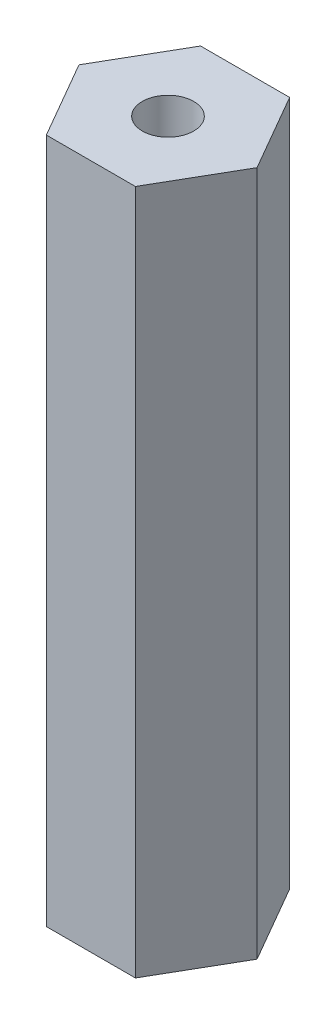
ISO-10303-21;
HEADER;
FILE_DESCRIPTION(('STEP AP214'),'2;1');
FILE_NAME('part.step','',(''),(''),'','','');
FILE_SCHEMA(('AUTOMOTIVE_DESIGN { 1 0 10303 214 1 1 1 1 }'));
ENDSEC;
DATA;
#1=APPLICATION_CONTEXT('core data for automotive mechanical design processes');
#2=APPLICATION_PROTOCOL_DEFINITION('international standard','automotive_design',2000,#1);
#3=PRODUCT_CONTEXT('',#1,'mechanical');
#4=PRODUCT('Part','Part','',(#3));
#5=PRODUCT_RELATED_PRODUCT_CATEGORY('part','',(#4));
#6=PRODUCT_DEFINITION_FORMATION('','',#4);
#7=PRODUCT_DEFINITION_CONTEXT('part definition',#1,'design');
#8=PRODUCT_DEFINITION('design','',#6,#7);
#9=PRODUCT_DEFINITION_SHAPE('','',#8);
#10=(LENGTH_UNIT() NAMED_UNIT(*) SI_UNIT(.MILLI.,.METRE.));
#11=(NAMED_UNIT(*) PLANE_ANGLE_UNIT() SI_UNIT($,.RADIAN.));
#12=(NAMED_UNIT(*) SI_UNIT($,.STERADIAN.) SOLID_ANGLE_UNIT());
#13=UNCERTAINTY_MEASURE_WITH_UNIT(LENGTH_MEASURE(1.E-05),#10,'distance_accuracy_value','');
#14=(GEOMETRIC_REPRESENTATION_CONTEXT(3) GLOBAL_UNCERTAINTY_ASSIGNED_CONTEXT((#13)) GLOBAL_UNIT_ASSIGNED_CONTEXT((#10,
#11,#12)) REPRESENTATION_CONTEXT('',''));
#15=CARTESIAN_POINT('',(0.,0.,0.));
#16=DIRECTION('',(0.,0.,1.));
#17=DIRECTION('',(1.,0.,0.));
#18=AXIS2_PLACEMENT_3D('',#15,#16,#17);
#19=CARTESIAN_POINT('',(0.,20.,4.5));
#20=DIRECTION('',(0.,0.,-1.));
#21=DIRECTION('',(-1.,0.,0.));
#22=AXIS2_PLACEMENT_3D('',#19,#20,#21);
#23=PLANE('',#22);
#24=DIRECTION('',(1.,0.,0.));
#25=VECTOR('',#24,1.);
#26=CARTESIAN_POINT('',(0.,-20.,4.5));
#27=LINE('',#26,#25);
#28=CARTESIAN_POINT('',(-2.59807621135332,-20.,4.5));
#29=VERTEX_POINT('',#28);
#30=CARTESIAN_POINT('',(2.59807621135332,-20.,4.5));
#31=VERTEX_POINT('',#30);
#32=EDGE_CURVE('E123',#29,#31,#27,.T.);
#33=ORIENTED_EDGE('',*,*,#32,.T.);
#34=DIRECTION('',(0.,-1.,0.));
#35=VECTOR('',#34,1.);
#36=CARTESIAN_POINT('',(2.59807621135332,20.,4.5));
#37=LINE('',#36,#35);
#38=CARTESIAN_POINT('',(2.59807621135332,20.,4.5));
#39=VERTEX_POINT('',#38);
#40=EDGE_CURVE('E11',#39,#31,#37,.T.);
#41=ORIENTED_EDGE('',*,*,#40,.F.);
#42=DIRECTION('',(1.,0.,0.));
#43=VECTOR('',#42,1.);
#44=CARTESIAN_POINT('',(0.,20.,4.5));
#45=LINE('',#44,#43);
#46=CARTESIAN_POINT('',(-2.59807621135332,20.,4.5));
#47=VERTEX_POINT('',#46);
#48=EDGE_CURVE('E146',#47,#39,#45,.T.);
#49=ORIENTED_EDGE('',*,*,#48,.F.);
#50=DIRECTION('',(0.,-1.,0.));
#51=VECTOR('',#50,1.);
#52=CARTESIAN_POINT('',(-2.59807621135332,20.,4.5));
#53=LINE('',#52,#51);
#54=EDGE_CURVE('E116',#47,#29,#53,.T.);
#55=ORIENTED_EDGE('',*,*,#54,.T.);
#56=EDGE_LOOP('',(#33,#41,#49,#55));
#57=FACE_BOUND('',#56,.T.);
#58=ADVANCED_FACE('F35',(#57),#23,.F.);
#59=CARTESIAN_POINT('',(3.89711431702997,20.,2.25));
#60=DIRECTION('',(-0.866025403784439,0.,-0.5));
#61=DIRECTION('',(-0.5,0.,0.866025403784439));
#62=AXIS2_PLACEMENT_3D('',#59,#60,#61);
#63=PLANE('',#62);
#64=DIRECTION('',(0.5,0.,-0.866025403784439));
#65=VECTOR('',#64,1.);
#66=CARTESIAN_POINT('',(3.89711431702997,-20.,2.25));
#67=LINE('',#66,#65);
#68=CARTESIAN_POINT('',(5.19615242270663,-20.,0.));
#69=VERTEX_POINT('',#68);
#70=EDGE_CURVE('E126',#31,#69,#67,.T.);
#71=ORIENTED_EDGE('',*,*,#70,.T.);
#72=DIRECTION('',(0.,-1.,0.));
#73=VECTOR('',#72,1.);
#74=CARTESIAN_POINT('',(5.19615242270663,20.,0.));
#75=LINE('',#74,#73);
#76=CARTESIAN_POINT('',(5.19615242270663,20.,0.));
#77=VERTEX_POINT('',#76);
#78=EDGE_CURVE('E44',#77,#69,#75,.T.);
#79=ORIENTED_EDGE('',*,*,#78,.F.);
#80=DIRECTION('',(0.5,0.,-0.866025403784439));
#81=VECTOR('',#80,1.);
#82=CARTESIAN_POINT('',(3.89711431702997,20.,2.25));
#83=LINE('',#82,#81);
#84=EDGE_CURVE('E89',#39,#77,#83,.T.);
#85=ORIENTED_EDGE('',*,*,#84,.F.);
#86=ORIENTED_EDGE('',*,*,#40,.T.);
#87=EDGE_LOOP('',(#71,#79,#85,#86));
#88=FACE_BOUND('',#87,.T.);
#89=ADVANCED_FACE('F160',(#88),#63,.F.);
#90=CARTESIAN_POINT('',(3.89711431702997,20.,-2.25));
#91=DIRECTION('',(-0.866025403784439,0.,0.5));
#92=DIRECTION('',(0.5,0.,0.866025403784439));
#93=AXIS2_PLACEMENT_3D('',#90,#91,#92);
#94=PLANE('',#93);
#95=DIRECTION('',(-0.5,0.,-0.866025403784439));
#96=VECTOR('',#95,1.);
#97=CARTESIAN_POINT('',(3.89711431702997,-20.,-2.25));
#98=LINE('',#97,#96);
#99=CARTESIAN_POINT('',(2.59807621135332,-20.,-4.5));
#100=VERTEX_POINT('',#99);
#101=EDGE_CURVE('E128',#69,#100,#98,.T.);
#102=ORIENTED_EDGE('',*,*,#101,.T.);
#103=DIRECTION('',(0.,-1.,0.));
#104=VECTOR('',#103,1.);
#105=CARTESIAN_POINT('',(2.59807621135332,20.,-4.5));
#106=LINE('',#105,#104);
#107=CARTESIAN_POINT('',(2.59807621135332,20.,-4.5));
#108=VERTEX_POINT('',#107);
#109=EDGE_CURVE('E111',#108,#100,#106,.T.);
#110=ORIENTED_EDGE('',*,*,#109,.F.);
#111=DIRECTION('',(-0.5,0.,-0.866025403784439));
#112=VECTOR('',#111,1.);
#113=CARTESIAN_POINT('',(3.89711431702997,20.,-2.25));
#114=LINE('',#113,#112);
#115=EDGE_CURVE('E102',#77,#108,#114,.T.);
#116=ORIENTED_EDGE('',*,*,#115,.F.);
#117=ORIENTED_EDGE('',*,*,#78,.T.);
#118=EDGE_LOOP('',(#102,#110,#116,#117));
#119=FACE_BOUND('',#118,.T.);
#120=ADVANCED_FACE('F139',(#119),#94,.F.);
#121=CARTESIAN_POINT('',(0.,20.,-4.5));
#122=DIRECTION('',(0.,0.,1.));
#123=DIRECTION('',(1.,0.,0.));
#124=AXIS2_PLACEMENT_3D('',#121,#122,#123);
#125=PLANE('',#124);
#126=DIRECTION('',(-1.,0.,0.));
#127=VECTOR('',#126,1.);
#128=CARTESIAN_POINT('',(0.,-20.,-4.5));
#129=LINE('',#128,#127);
#130=CARTESIAN_POINT('',(-2.59807621135332,-20.,-4.5));
#131=VERTEX_POINT('',#130);
#132=EDGE_CURVE('E110',#100,#131,#129,.T.);
#133=ORIENTED_EDGE('',*,*,#132,.T.);
#134=DIRECTION('',(0.,-1.,0.));
#135=VECTOR('',#134,1.);
#136=CARTESIAN_POINT('',(-2.59807621135332,20.,-4.5));
#137=LINE('',#136,#135);
#138=CARTESIAN_POINT('',(-2.59807621135332,20.,-4.5));
#139=VERTEX_POINT('',#138);
#140=EDGE_CURVE('E107',#139,#131,#137,.T.);
#141=ORIENTED_EDGE('',*,*,#140,.F.);
#142=DIRECTION('',(-1.,0.,0.));
#143=VECTOR('',#142,1.);
#144=CARTESIAN_POINT('',(0.,20.,-4.5));
#145=LINE('',#144,#143);
#146=EDGE_CURVE('E96',#108,#139,#145,.T.);
#147=ORIENTED_EDGE('',*,*,#146,.F.);
#148=ORIENTED_EDGE('',*,*,#109,.T.);
#149=EDGE_LOOP('',(#133,#141,#147,#148));
#150=FACE_BOUND('',#149,.T.);
#151=ADVANCED_FACE('F108',(#150),#125,.F.);
#152=CARTESIAN_POINT('',(-3.89711431702998,20.,-2.25));
#153=DIRECTION('',(0.866025403784439,0.,0.5));
#154=DIRECTION('',(0.5,0.,-0.866025403784439));
#155=AXIS2_PLACEMENT_3D('',#152,#153,#154);
#156=PLANE('',#155);
#157=DIRECTION('',(-0.5,0.,0.866025403784439));
#158=VECTOR('',#157,1.);
#159=CARTESIAN_POINT('',(-3.89711431702998,-20.,-2.25));
#160=LINE('',#159,#158);
#161=CARTESIAN_POINT('',(-5.19615242270663,-20.,0.));
#162=VERTEX_POINT('',#161);
#163=EDGE_CURVE('E75',#131,#162,#160,.T.);
#164=ORIENTED_EDGE('',*,*,#163,.T.);
#165=DIRECTION('',(0.,-1.,0.));
#166=VECTOR('',#165,1.);
#167=CARTESIAN_POINT('',(-5.19615242270663,20.,0.));
#168=LINE('',#167,#166);
#169=CARTESIAN_POINT('',(-5.19615242270663,20.,0.));
#170=VERTEX_POINT('',#169);
#171=EDGE_CURVE('E112',#170,#162,#168,.T.);
#172=ORIENTED_EDGE('',*,*,#171,.F.);
#173=DIRECTION('',(-0.5,0.,0.866025403784439));
#174=VECTOR('',#173,1.);
#175=CARTESIAN_POINT('',(-3.89711431702998,20.,-2.25));
#176=LINE('',#175,#174);
#177=EDGE_CURVE('E100',#139,#170,#176,.T.);
#178=ORIENTED_EDGE('',*,*,#177,.F.);
#179=ORIENTED_EDGE('',*,*,#140,.T.);
#180=EDGE_LOOP('',(#164,#172,#178,#179));
#181=FACE_BOUND('',#180,.T.);
#182=ADVANCED_FACE('F114',(#181),#156,.F.);
#183=CARTESIAN_POINT('',(0.,20.,0.));
#184=DIRECTION('',(0.,-1.,0.));
#185=DIRECTION('',(0.,0.,-1.));
#186=AXIS2_PLACEMENT_3D('',#183,#184,#185);
#187=CYLINDRICAL_SURFACE('',#186,1.5);
#188=CARTESIAN_POINT('',(0.,20.,0.));
#189=DIRECTION('',(0.,1.,0.));
#190=DIRECTION('',(0.,0.,1.));
#191=AXIS2_PLACEMENT_3D('',#188,#189,#190);
#192=CIRCLE('',#191,1.5);
#193=CARTESIAN_POINT('',(0.,20.,1.5));
#194=VERTEX_POINT('',#193);
#195=EDGE_CURVE('E133',#194,#194,#192,.T.);
#196=ORIENTED_EDGE('',*,*,#195,.T.);
#197=EDGE_LOOP('',(#196));
#198=FACE_BOUND('',#197,.T.);
#199=CARTESIAN_POINT('',(0.,-20.,0.));
#200=DIRECTION('',(0.,1.,0.));
#201=DIRECTION('',(0.,0.,1.));
#202=AXIS2_PLACEMENT_3D('',#199,#200,#201);
#203=CIRCLE('',#202,1.5);
#204=CARTESIAN_POINT('',(0.,-20.,1.5));
#205=VERTEX_POINT('',#204);
#206=EDGE_CURVE('E120',#205,#205,#203,.T.);
#207=ORIENTED_EDGE('',*,*,#206,.F.);
#208=EDGE_LOOP('',(#207));
#209=FACE_BOUND('',#208,.T.);
#210=ADVANCED_FACE('F37',(#198,#209),#187,.F.);
#211=CARTESIAN_POINT('',(-3.89711431702998,20.,2.25));
#212=DIRECTION('',(0.866025403784439,0.,-0.5));
#213=DIRECTION('',(-0.5,0.,-0.866025403784439));
#214=AXIS2_PLACEMENT_3D('',#211,#212,#213);
#215=PLANE('',#214);
#216=DIRECTION('',(0.5,0.,0.866025403784439));
#217=VECTOR('',#216,1.);
#218=CARTESIAN_POINT('',(-3.89711431702998,-20.,2.25));
#219=LINE('',#218,#217);
#220=EDGE_CURVE('E81',#162,#29,#219,.T.);
#221=ORIENTED_EDGE('',*,*,#220,.T.);
#222=ORIENTED_EDGE('',*,*,#54,.F.);
#223=DIRECTION('',(0.5,0.,0.866025403784439));
#224=VECTOR('',#223,1.);
#225=CARTESIAN_POINT('',(-3.89711431702998,20.,2.25));
#226=LINE('',#225,#224);
#227=EDGE_CURVE('E52',#170,#47,#226,.T.);
#228=ORIENTED_EDGE('',*,*,#227,.F.);
#229=ORIENTED_EDGE('',*,*,#171,.T.);
#230=EDGE_LOOP('',(#221,#222,#228,#229));
#231=FACE_BOUND('',#230,.T.);
#232=ADVANCED_FACE('F147',(#231),#215,.F.);
#233=CARTESIAN_POINT('',(0.,20.,0.));
#234=DIRECTION('',(0.,1.,0.));
#235=DIRECTION('',(0.,0.,1.));
#236=AXIS2_PLACEMENT_3D('',#233,#234,#235);
#237=PLANE('',#236);
#238=ORIENTED_EDGE('',*,*,#195,.F.);
#239=EDGE_LOOP('',(#238));
#240=FACE_BOUND('',#239,.T.);
#241=ORIENTED_EDGE('',*,*,#48,.T.);
#242=ORIENTED_EDGE('',*,*,#84,.T.);
#243=ORIENTED_EDGE('',*,*,#115,.T.);
#244=ORIENTED_EDGE('',*,*,#146,.T.);
#245=ORIENTED_EDGE('',*,*,#177,.T.);
#246=ORIENTED_EDGE('',*,*,#227,.T.);
#247=EDGE_LOOP('',(#241,#242,#243,#244,#245,#246));
#248=FACE_BOUND('',#247,.T.);
#249=ADVANCED_FACE('F98',(#240,#248),#237,.T.);
#250=CARTESIAN_POINT('',(0.,-20.,0.));
#251=DIRECTION('',(0.,1.,0.));
#252=DIRECTION('',(0.,0.,1.));
#253=AXIS2_PLACEMENT_3D('',#250,#251,#252);
#254=PLANE('',#253);
#255=ORIENTED_EDGE('',*,*,#206,.T.);
#256=EDGE_LOOP('',(#255));
#257=FACE_BOUND('',#256,.T.);
#258=ORIENTED_EDGE('',*,*,#32,.F.);
#259=ORIENTED_EDGE('',*,*,#220,.F.);
#260=ORIENTED_EDGE('',*,*,#163,.F.);
#261=ORIENTED_EDGE('',*,*,#132,.F.);
#262=ORIENTED_EDGE('',*,*,#101,.F.);
#263=ORIENTED_EDGE('',*,*,#70,.F.);
#264=EDGE_LOOP('',(#258,#259,#260,#261,#262,#263));
#265=FACE_BOUND('',#264,.T.);
#266=ADVANCED_FACE('F142',(#257,#265),#254,.F.);
#267=CLOSED_SHELL('',(#58,#89,#120,#151,#182,#210,#232,#249,#266));
#268=MANIFOLD_SOLID_BREP('B2',#267);
#269=ADVANCED_BREP_SHAPE_REPRESENTATION('',(#18,#268),#14);
#270=SHAPE_DEFINITION_REPRESENTATION(#9,#269);
ENDSEC;
END-ISO-10303-21;
